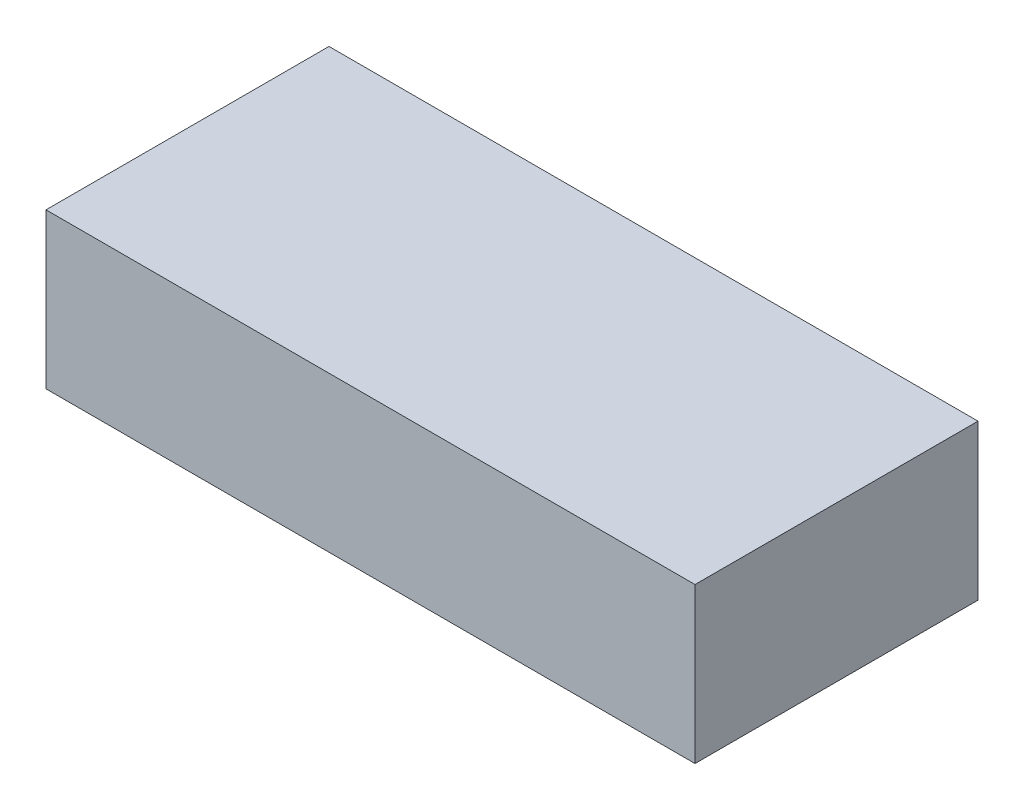
ISO-10303-21;
HEADER;
FILE_DESCRIPTION(('STEP AP214'),'2;1');
FILE_NAME('part.step','',(''),(''),'','','');
FILE_SCHEMA(('AUTOMOTIVE_DESIGN { 1 0 10303 214 1 1 1 1 }'));
ENDSEC;
DATA;
#1=APPLICATION_CONTEXT('core data for automotive mechanical design processes');
#2=APPLICATION_PROTOCOL_DEFINITION('international standard','automotive_design',2000,#1);
#3=PRODUCT_CONTEXT('',#1,'mechanical');
#4=PRODUCT('Part','Part','',(#3));
#5=PRODUCT_RELATED_PRODUCT_CATEGORY('part','',(#4));
#6=PRODUCT_DEFINITION_FORMATION('','',#4);
#7=PRODUCT_DEFINITION_CONTEXT('part definition',#1,'design');
#8=PRODUCT_DEFINITION('design','',#6,#7);
#9=PRODUCT_DEFINITION_SHAPE('','',#8);
#10=(LENGTH_UNIT() NAMED_UNIT(*) SI_UNIT(.MILLI.,.METRE.));
#11=(NAMED_UNIT(*) PLANE_ANGLE_UNIT() SI_UNIT($,.RADIAN.));
#12=(NAMED_UNIT(*) SI_UNIT($,.STERADIAN.) SOLID_ANGLE_UNIT());
#13=UNCERTAINTY_MEASURE_WITH_UNIT(LENGTH_MEASURE(1.E-05),#10,'distance_accuracy_value','');
#14=(GEOMETRIC_REPRESENTATION_CONTEXT(3) GLOBAL_UNCERTAINTY_ASSIGNED_CONTEXT((#13)) GLOBAL_UNIT_ASSIGNED_CONTEXT((#10,
#11,#12)) REPRESENTATION_CONTEXT('',''));
#15=CARTESIAN_POINT('',(0.,0.,0.));
#16=DIRECTION('',(0.,0.,1.));
#17=DIRECTION('',(1.,0.,0.));
#18=AXIS2_PLACEMENT_3D('',#15,#16,#17);
#19=CARTESIAN_POINT('',(48.641,23.241,-21.209));
#20=DIRECTION('',(-1.,0.,0.));
#21=DIRECTION('',(0.,0.,1.));
#22=AXIS2_PLACEMENT_3D('',#19,#20,#21);
#23=PLANE('',#22);
#24=DIRECTION('',(0.,0.,-1.));
#25=VECTOR('',#24,1.);
#26=CARTESIAN_POINT('',(48.641,0.,-21.209));
#27=LINE('',#26,#25);
#28=CARTESIAN_POINT('',(48.641,0.,21.209));
#29=VERTEX_POINT('',#28);
#30=CARTESIAN_POINT('',(48.641,0.,-21.209));
#31=VERTEX_POINT('',#30);
#32=EDGE_CURVE('E111',#29,#31,#27,.T.);
#33=ORIENTED_EDGE('',*,*,#32,.T.);
#34=DIRECTION('',(0.,-1.,0.));
#35=VECTOR('',#34,1.);
#36=CARTESIAN_POINT('',(48.641,23.241,-21.209));
#37=LINE('',#36,#35);
#38=CARTESIAN_POINT('',(48.641,23.241,-21.209));
#39=VERTEX_POINT('',#38);
#40=EDGE_CURVE('E11',#39,#31,#37,.T.);
#41=ORIENTED_EDGE('',*,*,#40,.F.);
#42=DIRECTION('',(0.,0.,-1.));
#43=VECTOR('',#42,1.);
#44=CARTESIAN_POINT('',(48.641,23.241,-21.209));
#45=LINE('',#44,#43);
#46=CARTESIAN_POINT('',(48.641,23.241,21.209));
#47=VERTEX_POINT('',#46);
#48=EDGE_CURVE('E95',#47,#39,#45,.T.);
#49=ORIENTED_EDGE('',*,*,#48,.F.);
#50=DIRECTION('',(0.,-1.,0.));
#51=VECTOR('',#50,1.);
#52=CARTESIAN_POINT('',(48.641,23.241,21.209));
#53=LINE('',#52,#51);
#54=EDGE_CURVE('E107',#47,#29,#53,.T.);
#55=ORIENTED_EDGE('',*,*,#54,.T.);
#56=EDGE_LOOP('',(#33,#41,#49,#55));
#57=FACE_BOUND('',#56,.T.);
#58=ADVANCED_FACE('F43',(#57),#23,.F.);
#59=CARTESIAN_POINT('',(-48.641,23.241,-21.209));
#60=DIRECTION('',(0.,0.,1.));
#61=DIRECTION('',(1.,0.,0.));
#62=AXIS2_PLACEMENT_3D('',#59,#60,#61);
#63=PLANE('',#62);
#64=DIRECTION('',(-1.,0.,0.));
#65=VECTOR('',#64,1.);
#66=CARTESIAN_POINT('',(-48.641,0.,-21.209));
#67=LINE('',#66,#65);
#68=CARTESIAN_POINT('',(-48.641,0.,-21.209));
#69=VERTEX_POINT('',#68);
#70=EDGE_CURVE('E100',#31,#69,#67,.T.);
#71=ORIENTED_EDGE('',*,*,#70,.T.);
#72=DIRECTION('',(0.,-1.,0.));
#73=VECTOR('',#72,1.);
#74=CARTESIAN_POINT('',(-48.641,23.241,-21.209));
#75=LINE('',#74,#73);
#76=CARTESIAN_POINT('',(-48.641,23.241,-21.209));
#77=VERTEX_POINT('',#76);
#78=EDGE_CURVE('E52',#77,#69,#75,.T.);
#79=ORIENTED_EDGE('',*,*,#78,.F.);
#80=DIRECTION('',(-1.,0.,0.));
#81=VECTOR('',#80,1.);
#82=CARTESIAN_POINT('',(-48.641,23.241,-21.209));
#83=LINE('',#82,#81);
#84=EDGE_CURVE('E90',#39,#77,#83,.T.);
#85=ORIENTED_EDGE('',*,*,#84,.F.);
#86=ORIENTED_EDGE('',*,*,#40,.T.);
#87=EDGE_LOOP('',(#71,#79,#85,#86));
#88=FACE_BOUND('',#87,.T.);
#89=ADVANCED_FACE('F99',(#88),#63,.F.);
#90=CARTESIAN_POINT('',(-48.641,23.241,-21.209));
#91=DIRECTION('',(1.,0.,0.));
#92=DIRECTION('',(0.,0.,-1.));
#93=AXIS2_PLACEMENT_3D('',#90,#91,#92);
#94=PLANE('',#93);
#95=DIRECTION('',(0.,0.,1.));
#96=VECTOR('',#95,1.);
#97=CARTESIAN_POINT('',(-48.641,0.,-21.209));
#98=LINE('',#97,#96);
#99=CARTESIAN_POINT('',(-48.641,0.,21.209));
#100=VERTEX_POINT('',#99);
#101=EDGE_CURVE('E77',#69,#100,#98,.T.);
#102=ORIENTED_EDGE('',*,*,#101,.T.);
#103=DIRECTION('',(0.,-1.,0.));
#104=VECTOR('',#103,1.);
#105=CARTESIAN_POINT('',(-48.641,23.241,21.209));
#106=LINE('',#105,#104);
#107=CARTESIAN_POINT('',(-48.641,23.241,21.209));
#108=VERTEX_POINT('',#107);
#109=EDGE_CURVE('E102',#108,#100,#106,.T.);
#110=ORIENTED_EDGE('',*,*,#109,.F.);
#111=DIRECTION('',(0.,0.,1.));
#112=VECTOR('',#111,1.);
#113=CARTESIAN_POINT('',(-48.641,23.241,-21.209));
#114=LINE('',#113,#112);
#115=EDGE_CURVE('E93',#77,#108,#114,.T.);
#116=ORIENTED_EDGE('',*,*,#115,.F.);
#117=ORIENTED_EDGE('',*,*,#78,.T.);
#118=EDGE_LOOP('',(#102,#110,#116,#117));
#119=FACE_BOUND('',#118,.T.);
#120=ADVANCED_FACE('F103',(#119),#94,.F.);
#121=CARTESIAN_POINT('',(-48.641,23.241,21.209));
#122=DIRECTION('',(0.,0.,-1.));
#123=DIRECTION('',(-1.,0.,0.));
#124=AXIS2_PLACEMENT_3D('',#121,#122,#123);
#125=PLANE('',#124);
#126=DIRECTION('',(1.,0.,0.));
#127=VECTOR('',#126,1.);
#128=CARTESIAN_POINT('',(-48.641,0.,21.209));
#129=LINE('',#128,#127);
#130=EDGE_CURVE('E83',#100,#29,#129,.T.);
#131=ORIENTED_EDGE('',*,*,#130,.T.);
#132=ORIENTED_EDGE('',*,*,#54,.F.);
#133=DIRECTION('',(1.,0.,0.));
#134=VECTOR('',#133,1.);
#135=CARTESIAN_POINT('',(-48.641,23.241,21.209));
#136=LINE('',#135,#134);
#137=EDGE_CURVE('E60',#108,#47,#136,.T.);
#138=ORIENTED_EDGE('',*,*,#137,.F.);
#139=ORIENTED_EDGE('',*,*,#109,.T.);
#140=EDGE_LOOP('',(#131,#132,#138,#139));
#141=FACE_BOUND('',#140,.T.);
#142=ADVANCED_FACE('F124',(#141),#125,.F.);
#143=CARTESIAN_POINT('',(0.,23.241,0.));
#144=DIRECTION('',(0.,1.,0.));
#145=DIRECTION('',(0.,0.,1.));
#146=AXIS2_PLACEMENT_3D('',#143,#144,#145);
#147=PLANE('',#146);
#148=ORIENTED_EDGE('',*,*,#48,.T.);
#149=ORIENTED_EDGE('',*,*,#84,.T.);
#150=ORIENTED_EDGE('',*,*,#115,.T.);
#151=ORIENTED_EDGE('',*,*,#137,.T.);
#152=EDGE_LOOP('',(#148,#149,#150,#151));
#153=FACE_BOUND('',#152,.T.);
#154=ADVANCED_FACE('F91',(#153),#147,.T.);
#155=CARTESIAN_POINT('',(0.,0.,0.));
#156=DIRECTION('',(0.,1.,0.));
#157=DIRECTION('',(0.,0.,1.));
#158=AXIS2_PLACEMENT_3D('',#155,#156,#157);
#159=PLANE('',#158);
#160=ORIENTED_EDGE('',*,*,#32,.F.);
#161=ORIENTED_EDGE('',*,*,#130,.F.);
#162=ORIENTED_EDGE('',*,*,#101,.F.);
#163=ORIENTED_EDGE('',*,*,#70,.F.);
#164=EDGE_LOOP('',(#160,#161,#162,#163));
#165=FACE_BOUND('',#164,.T.);
#166=ADVANCED_FACE('F127',(#165),#159,.F.);
#167=CLOSED_SHELL('',(#58,#89,#120,#142,#154,#166));
#168=MANIFOLD_SOLID_BREP('B2',#167);
#169=ADVANCED_BREP_SHAPE_REPRESENTATION('',(#18,#168),#14);
#170=SHAPE_DEFINITION_REPRESENTATION(#9,#169);
ENDSEC;
END-ISO-10303-21;
